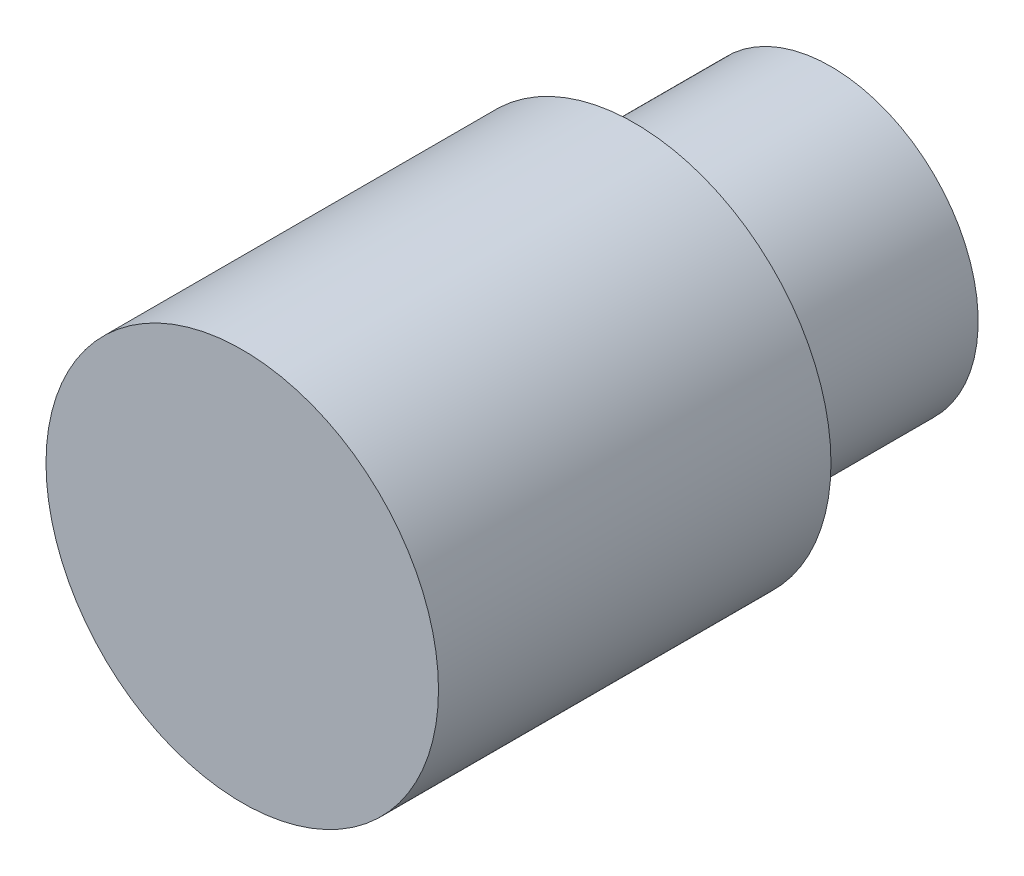
ISO-10303-21;
HEADER;
FILE_DESCRIPTION(('STEP AP214'),'2;1');
FILE_NAME('part.step','',(''),(''),'','','');
FILE_SCHEMA(('AUTOMOTIVE_DESIGN { 1 0 10303 214 1 1 1 1 }'));
ENDSEC;
DATA;
#1=APPLICATION_CONTEXT('core data for automotive mechanical design processes');
#2=APPLICATION_PROTOCOL_DEFINITION('international standard','automotive_design',2000,#1);
#3=PRODUCT_CONTEXT('',#1,'mechanical');
#4=PRODUCT('Part','Part','',(#3));
#5=PRODUCT_RELATED_PRODUCT_CATEGORY('part','',(#4));
#6=PRODUCT_DEFINITION_FORMATION('','',#4);
#7=PRODUCT_DEFINITION_CONTEXT('part definition',#1,'design');
#8=PRODUCT_DEFINITION('design','',#6,#7);
#9=PRODUCT_DEFINITION_SHAPE('','',#8);
#10=(LENGTH_UNIT() NAMED_UNIT(*) SI_UNIT(.MILLI.,.METRE.));
#11=(NAMED_UNIT(*) PLANE_ANGLE_UNIT() SI_UNIT($,.RADIAN.));
#12=(NAMED_UNIT(*) SI_UNIT($,.STERADIAN.) SOLID_ANGLE_UNIT());
#13=UNCERTAINTY_MEASURE_WITH_UNIT(LENGTH_MEASURE(1.E-05),#10,'distance_accuracy_value','');
#14=(GEOMETRIC_REPRESENTATION_CONTEXT(3) GLOBAL_UNCERTAINTY_ASSIGNED_CONTEXT((#13)) GLOBAL_UNIT_ASSIGNED_CONTEXT((#10,
#11,#12)) REPRESENTATION_CONTEXT('',''));
#15=CARTESIAN_POINT('',(0.,0.,0.));
#16=DIRECTION('',(0.,0.,1.));
#17=DIRECTION('',(1.,0.,0.));
#18=AXIS2_PLACEMENT_3D('',#15,#16,#17);
#19=CARTESIAN_POINT('',(0.,-50.,0.));
#20=DIRECTION('',(0.,0.,1.));
#21=DIRECTION('',(1.,0.,0.));
#22=AXIS2_PLACEMENT_3D('',#19,#20,#21);
#23=PLANE('',#22);
#24=CARTESIAN_POINT('',(0.,0.,0.));
#25=DIRECTION('',(0.,0.,1.));
#26=DIRECTION('',(1.,0.,0.));
#27=AXIS2_PLACEMENT_3D('',#24,#25,#26);
#28=CIRCLE('',#27,50.);
#29=CARTESIAN_POINT('',(50.,0.,0.));
#30=VERTEX_POINT('',#29);
#31=EDGE_CURVE('E48',#30,#30,#28,.T.);
#32=ORIENTED_EDGE('',*,*,#31,.T.);
#33=EDGE_LOOP('',(#32));
#34=FACE_BOUND('',#33,.T.);
#35=ADVANCED_FACE('F37',(#34),#23,.T.);
#36=CARTESIAN_POINT('',(0.,-50.,-100.));
#37=DIRECTION('',(0.,0.,-1.));
#38=DIRECTION('',(-1.,0.,0.));
#39=AXIS2_PLACEMENT_3D('',#36,#37,#38);
#40=PLANE('',#39);
#41=CARTESIAN_POINT('',(0.,0.,-100.));
#42=DIRECTION('',(0.,0.,-1.));
#43=DIRECTION('',(-1.,0.,0.));
#44=AXIS2_PLACEMENT_3D('',#41,#42,#43);
#45=CIRCLE('',#44,37.5);
#46=CARTESIAN_POINT('',(-37.5,0.,-100.));
#47=VERTEX_POINT('',#46);
#48=EDGE_CURVE('E10',#47,#47,#45,.T.);
#49=ORIENTED_EDGE('',*,*,#48,.F.);
#50=EDGE_LOOP('',(#49));
#51=FACE_BOUND('',#50,.T.);
#52=CARTESIAN_POINT('',(0.,0.,-100.));
#53=DIRECTION('',(0.,0.,1.));
#54=DIRECTION('',(1.,0.,0.));
#55=AXIS2_PLACEMENT_3D('',#52,#53,#54);
#56=CIRCLE('',#55,50.);
#57=CARTESIAN_POINT('',(50.,0.,-100.));
#58=VERTEX_POINT('',#57);
#59=EDGE_CURVE('E40',#58,#58,#56,.T.);
#60=ORIENTED_EDGE('',*,*,#59,.F.);
#61=EDGE_LOOP('',(#60));
#62=FACE_BOUND('',#61,.T.);
#63=ADVANCED_FACE('F69',(#51,#62),#40,.T.);
#64=CARTESIAN_POINT('',(0.,0.,0.));
#65=DIRECTION('',(0.,0.,1.));
#66=DIRECTION('',(1.,0.,0.));
#67=AXIS2_PLACEMENT_3D('',#64,#65,#66);
#68=CYLINDRICAL_SURFACE('',#67,50.);
#69=ORIENTED_EDGE('',*,*,#59,.T.);
#70=EDGE_LOOP('',(#69));
#71=FACE_BOUND('',#70,.T.);
#72=ORIENTED_EDGE('',*,*,#31,.F.);
#73=EDGE_LOOP('',(#72));
#74=FACE_BOUND('',#73,.T.);
#75=ADVANCED_FACE('F61',(#71,#74),#68,.T.);
#76=CARTESIAN_POINT('',(0.,0.,-150.));
#77=DIRECTION('',(0.,0.,1.));
#78=DIRECTION('',(1.,0.,0.));
#79=AXIS2_PLACEMENT_3D('',#76,#77,#78);
#80=CYLINDRICAL_SURFACE('',#79,37.5);
#81=CARTESIAN_POINT('',(0.,0.,-150.));
#82=DIRECTION('',(0.,0.,-1.));
#83=DIRECTION('',(-1.,0.,0.));
#84=AXIS2_PLACEMENT_3D('',#81,#82,#83);
#85=CIRCLE('',#84,37.5);
#86=CARTESIAN_POINT('',(-37.5,0.,-150.));
#87=VERTEX_POINT('',#86);
#88=EDGE_CURVE('E50',#87,#87,#85,.T.);
#89=ORIENTED_EDGE('',*,*,#88,.F.);
#90=EDGE_LOOP('',(#89));
#91=FACE_BOUND('',#90,.T.);
#92=ORIENTED_EDGE('',*,*,#48,.T.);
#93=EDGE_LOOP('',(#92));
#94=FACE_BOUND('',#93,.T.);
#95=ADVANCED_FACE('F59',(#91,#94),#80,.T.);
#96=CARTESIAN_POINT('',(0.,0.,-150.));
#97=DIRECTION('',(0.,0.,-1.));
#98=DIRECTION('',(-1.,0.,0.));
#99=AXIS2_PLACEMENT_3D('',#96,#97,#98);
#100=PLANE('',#99);
#101=ORIENTED_EDGE('',*,*,#88,.T.);
#102=EDGE_LOOP('',(#101));
#103=FACE_BOUND('',#102,.T.);
#104=ADVANCED_FACE('F57',(#103),#100,.T.);
#105=CLOSED_SHELL('',(#35,#63,#75,#95,#104));
#106=MANIFOLD_SOLID_BREP('B2',#105);
#107=ADVANCED_BREP_SHAPE_REPRESENTATION('',(#18,#106),#14);
#108=SHAPE_DEFINITION_REPRESENTATION(#9,#107);
ENDSEC;
END-ISO-10303-21;
